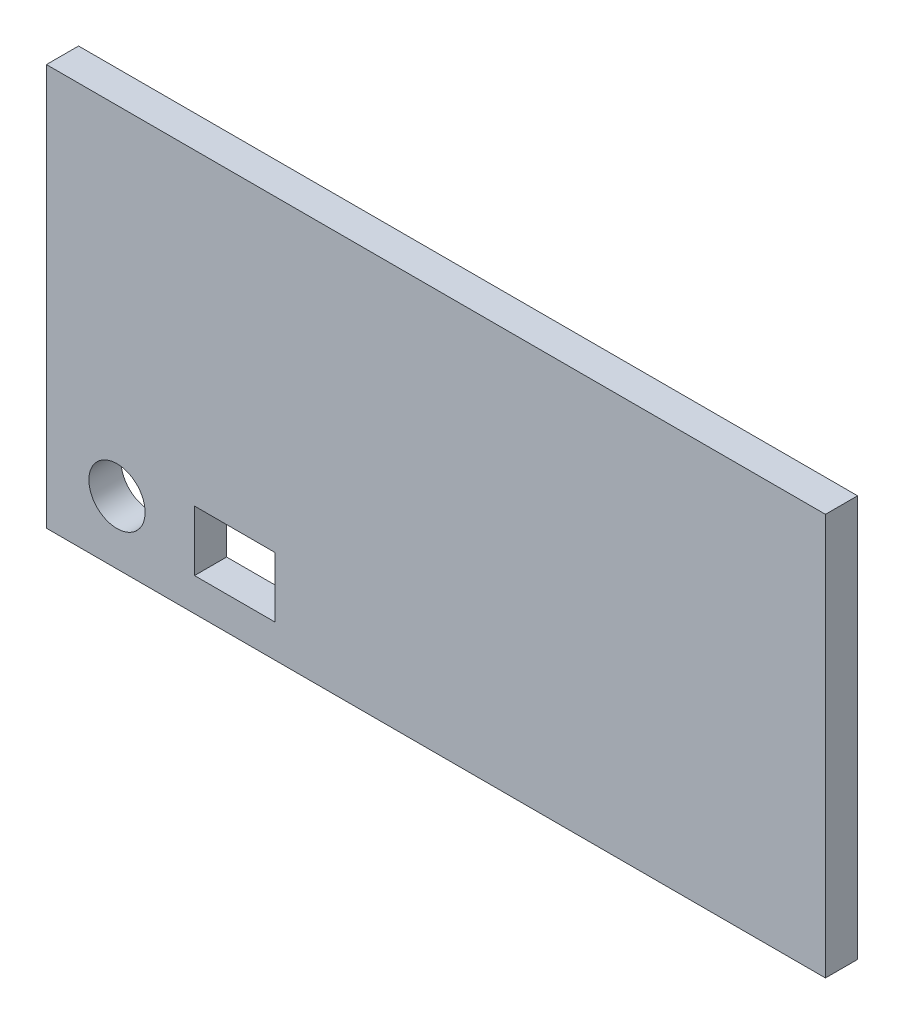
ISO-10303-21;
HEADER;
FILE_DESCRIPTION(('STEP AP214'),'2;1');
FILE_NAME('part.step','',(''),(''),'','','');
FILE_SCHEMA(('AUTOMOTIVE_DESIGN { 1 0 10303 214 1 1 1 1 }'));
ENDSEC;
DATA;
#1=APPLICATION_CONTEXT('core data for automotive mechanical design processes');
#2=APPLICATION_PROTOCOL_DEFINITION('international standard','automotive_design',2000,#1);
#3=PRODUCT_CONTEXT('',#1,'mechanical');
#4=PRODUCT('Part','Part','',(#3));
#5=PRODUCT_RELATED_PRODUCT_CATEGORY('part','',(#4));
#6=PRODUCT_DEFINITION_FORMATION('','',#4);
#7=PRODUCT_DEFINITION_CONTEXT('part definition',#1,'design');
#8=PRODUCT_DEFINITION('design','',#6,#7);
#9=PRODUCT_DEFINITION_SHAPE('','',#8);
#10=(LENGTH_UNIT() NAMED_UNIT(*) SI_UNIT(.MILLI.,.METRE.));
#11=(NAMED_UNIT(*) PLANE_ANGLE_UNIT() SI_UNIT($,.RADIAN.));
#12=(NAMED_UNIT(*) SI_UNIT($,.STERADIAN.) SOLID_ANGLE_UNIT());
#13=UNCERTAINTY_MEASURE_WITH_UNIT(LENGTH_MEASURE(1.E-05),#10,'distance_accuracy_value','');
#14=(GEOMETRIC_REPRESENTATION_CONTEXT(3) GLOBAL_UNCERTAINTY_ASSIGNED_CONTEXT((#13)) GLOBAL_UNIT_ASSIGNED_CONTEXT((#10,
#11,#12)) REPRESENTATION_CONTEXT('',''));
#15=CARTESIAN_POINT('',(0.,0.,0.));
#16=DIRECTION('',(0.,0.,1.));
#17=DIRECTION('',(1.,0.,0.));
#18=AXIS2_PLACEMENT_3D('',#15,#16,#17);
#19=CARTESIAN_POINT('',(0.,0.,8.));
#20=DIRECTION('',(0.,0.,1.));
#21=DIRECTION('',(1.,0.,0.));
#22=AXIS2_PLACEMENT_3D('',#19,#20,#21);
#23=PLANE('',#22);
#24=DIRECTION('',(0.,-1.,0.));
#25=VECTOR('',#24,1.);
#26=CARTESIAN_POINT('',(-104.714285714286,58.75,8.));
#27=LINE('',#26,#25);
#28=CARTESIAN_POINT('',(-104.714285714286,58.75,8.));
#29=VERTEX_POINT('',#28);
#30=CARTESIAN_POINT('',(-104.714285714286,-41.25,8.));
#31=VERTEX_POINT('',#30);
#32=EDGE_CURVE('E142',#29,#31,#27,.T.);
#33=ORIENTED_EDGE('',*,*,#32,.T.);
#34=DIRECTION('',(1.,0.,0.));
#35=VECTOR('',#34,1.);
#36=CARTESIAN_POINT('',(-104.714285714286,-41.25,8.));
#37=LINE('',#36,#35);
#38=CARTESIAN_POINT('',(89.2857142857143,-41.25,8.));
#39=VERTEX_POINT('',#38);
#40=EDGE_CURVE('E145',#31,#39,#37,.T.);
#41=ORIENTED_EDGE('',*,*,#40,.T.);
#42=DIRECTION('',(0.,1.,0.));
#43=VECTOR('',#42,1.);
#44=CARTESIAN_POINT('',(89.2857142857143,58.75,8.));
#45=LINE('',#44,#43);
#46=CARTESIAN_POINT('',(89.2857142857143,58.75,8.));
#47=VERTEX_POINT('',#46);
#48=EDGE_CURVE('E148',#39,#47,#45,.T.);
#49=ORIENTED_EDGE('',*,*,#48,.T.);
#50=DIRECTION('',(-1.,0.,0.));
#51=VECTOR('',#50,1.);
#52=CARTESIAN_POINT('',(-104.714285714286,58.75,8.));
#53=LINE('',#52,#51);
#54=EDGE_CURVE('E150',#47,#29,#53,.T.);
#55=ORIENTED_EDGE('',*,*,#54,.T.);
#56=EDGE_LOOP('',(#33,#41,#49,#55));
#57=FACE_BOUND('',#56,.T.);
#58=CARTESIAN_POINT('',(-87.1428571428571,-25.5357142857143,8.));
#59=DIRECTION('',(0.,0.,1.));
#60=DIRECTION('',(1.,0.,0.));
#61=AXIS2_PLACEMENT_3D('',#58,#59,#60);
#62=CIRCLE('',#61,7.);
#63=CARTESIAN_POINT('',(-80.1428571428571,-25.5357142857143,8.));
#64=VERTEX_POINT('',#63);
#65=EDGE_CURVE('E136',#64,#64,#62,.T.);
#66=ORIENTED_EDGE('',*,*,#65,.F.);
#67=EDGE_LOOP('',(#66));
#68=FACE_BOUND('',#67,.T.);
#69=DIRECTION('',(1.,0.,0.));
#70=VECTOR('',#69,1.);
#71=CARTESIAN_POINT('',(-67.839372956239,-33.0242407706737,8.));
#72=LINE('',#71,#70);
#73=CARTESIAN_POINT('',(-67.839372956239,-33.0242407706737,8.));
#74=VERTEX_POINT('',#73);
#75=CARTESIAN_POINT('',(-47.839372956239,-33.0242407706737,8.));
#76=VERTEX_POINT('',#75);
#77=EDGE_CURVE('E108',#74,#76,#72,.T.);
#78=ORIENTED_EDGE('',*,*,#77,.F.);
#79=DIRECTION('',(0.,-1.,0.));
#80=VECTOR('',#79,1.);
#81=CARTESIAN_POINT('',(-67.839372956239,-18.0242407706737,8.));
#82=LINE('',#81,#80);
#83=CARTESIAN_POINT('',(-67.839372956239,-18.0242407706737,8.));
#84=VERTEX_POINT('',#83);
#85=EDGE_CURVE('E100',#84,#74,#82,.T.);
#86=ORIENTED_EDGE('',*,*,#85,.F.);
#87=DIRECTION('',(-1.,0.,0.));
#88=VECTOR('',#87,1.);
#89=CARTESIAN_POINT('',(-67.839372956239,-18.0242407706737,8.));
#90=LINE('',#89,#88);
#91=CARTESIAN_POINT('',(-47.839372956239,-18.0242407706737,8.));
#92=VERTEX_POINT('',#91);
#93=EDGE_CURVE('E122',#92,#84,#90,.T.);
#94=ORIENTED_EDGE('',*,*,#93,.F.);
#95=DIRECTION('',(0.,1.,0.));
#96=VECTOR('',#95,1.);
#97=CARTESIAN_POINT('',(-47.839372956239,-18.0242407706737,8.));
#98=LINE('',#97,#96);
#99=EDGE_CURVE('E120',#76,#92,#98,.T.);
#100=ORIENTED_EDGE('',*,*,#99,.F.);
#101=EDGE_LOOP('',(#78,#86,#94,#100));
#102=FACE_BOUND('',#101,.T.);
#103=ADVANCED_FACE('F35',(#57,#68,#102),#23,.T.);
#104=CARTESIAN_POINT('',(0.,0.,0.));
#105=DIRECTION('',(0.,0.,1.));
#106=DIRECTION('',(1.,0.,0.));
#107=AXIS2_PLACEMENT_3D('',#104,#105,#106);
#108=PLANE('',#107);
#109=CARTESIAN_POINT('',(-87.1428571428571,-25.5357142857143,0.));
#110=DIRECTION('',(0.,0.,1.));
#111=DIRECTION('',(1.,0.,0.));
#112=AXIS2_PLACEMENT_3D('',#109,#110,#111);
#113=CIRCLE('',#112,7.);
#114=CARTESIAN_POINT('',(-80.1428571428571,-25.5357142857143,0.));
#115=VERTEX_POINT('',#114);
#116=EDGE_CURVE('E116',#115,#115,#113,.T.);
#117=ORIENTED_EDGE('',*,*,#116,.T.);
#118=EDGE_LOOP('',(#117));
#119=FACE_BOUND('',#118,.T.);
#120=DIRECTION('',(0.,-1.,0.));
#121=VECTOR('',#120,1.);
#122=CARTESIAN_POINT('',(-104.714285714286,58.75,0.));
#123=LINE('',#122,#121);
#124=CARTESIAN_POINT('',(-104.714285714286,58.75,0.));
#125=VERTEX_POINT('',#124);
#126=CARTESIAN_POINT('',(-104.714285714286,-41.25,0.));
#127=VERTEX_POINT('',#126);
#128=EDGE_CURVE('E139',#125,#127,#123,.T.);
#129=ORIENTED_EDGE('',*,*,#128,.F.);
#130=DIRECTION('',(-1.,0.,0.));
#131=VECTOR('',#130,1.);
#132=CARTESIAN_POINT('',(-104.714285714286,58.75,0.));
#133=LINE('',#132,#131);
#134=CARTESIAN_POINT('',(89.2857142857143,58.75,0.));
#135=VERTEX_POINT('',#134);
#136=EDGE_CURVE('E146',#135,#125,#133,.T.);
#137=ORIENTED_EDGE('',*,*,#136,.F.);
#138=DIRECTION('',(0.,1.,0.));
#139=VECTOR('',#138,1.);
#140=CARTESIAN_POINT('',(89.2857142857143,58.75,0.));
#141=LINE('',#140,#139);
#142=CARTESIAN_POINT('',(89.2857142857143,-41.25,0.));
#143=VERTEX_POINT('',#142);
#144=EDGE_CURVE('E157',#143,#135,#141,.T.);
#145=ORIENTED_EDGE('',*,*,#144,.F.);
#146=DIRECTION('',(1.,0.,0.));
#147=VECTOR('',#146,1.);
#148=CARTESIAN_POINT('',(-104.714285714286,-41.25,0.));
#149=LINE('',#148,#147);
#150=EDGE_CURVE('E155',#127,#143,#149,.T.);
#151=ORIENTED_EDGE('',*,*,#150,.F.);
#152=EDGE_LOOP('',(#129,#137,#145,#151));
#153=FACE_BOUND('',#152,.T.);
#154=DIRECTION('',(0.,-1.,0.));
#155=VECTOR('',#154,1.);
#156=CARTESIAN_POINT('',(-67.839372956239,-18.0242407706737,0.));
#157=LINE('',#156,#155);
#158=CARTESIAN_POINT('',(-67.839372956239,-18.0242407706737,0.));
#159=VERTEX_POINT('',#158);
#160=CARTESIAN_POINT('',(-67.839372956239,-33.0242407706737,0.));
#161=VERTEX_POINT('',#160);
#162=EDGE_CURVE('E58',#159,#161,#157,.T.);
#163=ORIENTED_EDGE('',*,*,#162,.T.);
#164=DIRECTION('',(1.,0.,0.));
#165=VECTOR('',#164,1.);
#166=CARTESIAN_POINT('',(-67.839372956239,-33.0242407706737,0.));
#167=LINE('',#166,#165);
#168=CARTESIAN_POINT('',(-47.839372956239,-33.0242407706737,0.));
#169=VERTEX_POINT('',#168);
#170=EDGE_CURVE('E115',#161,#169,#167,.T.);
#171=ORIENTED_EDGE('',*,*,#170,.T.);
#172=DIRECTION('',(0.,1.,0.));
#173=VECTOR('',#172,1.);
#174=CARTESIAN_POINT('',(-47.839372956239,-18.0242407706737,0.));
#175=LINE('',#174,#173);
#176=CARTESIAN_POINT('',(-47.839372956239,-18.0242407706737,0.));
#177=VERTEX_POINT('',#176);
#178=EDGE_CURVE('E128',#169,#177,#175,.T.);
#179=ORIENTED_EDGE('',*,*,#178,.T.);
#180=DIRECTION('',(-1.,0.,0.));
#181=VECTOR('',#180,1.);
#182=CARTESIAN_POINT('',(-67.839372956239,-18.0242407706737,0.));
#183=LINE('',#182,#181);
#184=EDGE_CURVE('E109',#177,#159,#183,.T.);
#185=ORIENTED_EDGE('',*,*,#184,.T.);
#186=EDGE_LOOP('',(#163,#171,#179,#185));
#187=FACE_BOUND('',#186,.T.);
#188=ADVANCED_FACE('F175',(#119,#153,#187),#108,.F.);
#189=CARTESIAN_POINT('',(-104.714285714286,58.75,8.));
#190=DIRECTION('',(1.,0.,0.));
#191=DIRECTION('',(0.,1.,0.));
#192=AXIS2_PLACEMENT_3D('',#189,#190,#191);
#193=PLANE('',#192);
#194=ORIENTED_EDGE('',*,*,#128,.T.);
#195=DIRECTION('',(0.,0.,-1.));
#196=VECTOR('',#195,1.);
#197=CARTESIAN_POINT('',(-104.714285714286,-41.25,8.));
#198=LINE('',#197,#196);
#199=EDGE_CURVE('E11',#31,#127,#198,.T.);
#200=ORIENTED_EDGE('',*,*,#199,.F.);
#201=ORIENTED_EDGE('',*,*,#32,.F.);
#202=DIRECTION('',(0.,0.,-1.));
#203=VECTOR('',#202,1.);
#204=CARTESIAN_POINT('',(-104.714285714286,58.75,8.));
#205=LINE('',#204,#203);
#206=EDGE_CURVE('E152',#29,#125,#205,.T.);
#207=ORIENTED_EDGE('',*,*,#206,.T.);
#208=EDGE_LOOP('',(#194,#200,#201,#207));
#209=FACE_BOUND('',#208,.T.);
#210=ADVANCED_FACE('F37',(#209),#193,.F.);
#211=CARTESIAN_POINT('',(-104.714285714286,-41.25,8.));
#212=DIRECTION('',(0.,1.,0.));
#213=DIRECTION('',(0.,0.,1.));
#214=AXIS2_PLACEMENT_3D('',#211,#212,#213);
#215=PLANE('',#214);
#216=ORIENTED_EDGE('',*,*,#150,.T.);
#217=DIRECTION('',(0.,0.,-1.));
#218=VECTOR('',#217,1.);
#219=CARTESIAN_POINT('',(89.2857142857143,-41.25,8.));
#220=LINE('',#219,#218);
#221=EDGE_CURVE('E43',#39,#143,#220,.T.);
#222=ORIENTED_EDGE('',*,*,#221,.F.);
#223=ORIENTED_EDGE('',*,*,#40,.F.);
#224=ORIENTED_EDGE('',*,*,#199,.T.);
#225=EDGE_LOOP('',(#216,#222,#223,#224));
#226=FACE_BOUND('',#225,.T.);
#227=ADVANCED_FACE('F186',(#226),#215,.F.);
#228=CARTESIAN_POINT('',(89.2857142857143,58.75,8.));
#229=DIRECTION('',(-1.,0.,0.));
#230=DIRECTION('',(0.,0.,1.));
#231=AXIS2_PLACEMENT_3D('',#228,#229,#230);
#232=PLANE('',#231);
#233=ORIENTED_EDGE('',*,*,#144,.T.);
#234=DIRECTION('',(0.,0.,-1.));
#235=VECTOR('',#234,1.);
#236=CARTESIAN_POINT('',(89.2857142857143,58.75,8.));
#237=LINE('',#236,#235);
#238=EDGE_CURVE('E162',#47,#135,#237,.T.);
#239=ORIENTED_EDGE('',*,*,#238,.F.);
#240=ORIENTED_EDGE('',*,*,#48,.F.);
#241=ORIENTED_EDGE('',*,*,#221,.T.);
#242=EDGE_LOOP('',(#233,#239,#240,#241));
#243=FACE_BOUND('',#242,.T.);
#244=ADVANCED_FACE('F169',(#243),#232,.F.);
#245=CARTESIAN_POINT('',(-104.714285714286,58.75,8.));
#246=DIRECTION('',(0.,-1.,0.));
#247=DIRECTION('',(0.,0.,-1.));
#248=AXIS2_PLACEMENT_3D('',#245,#246,#247);
#249=PLANE('',#248);
#250=ORIENTED_EDGE('',*,*,#136,.T.);
#251=ORIENTED_EDGE('',*,*,#206,.F.);
#252=ORIENTED_EDGE('',*,*,#54,.F.);
#253=ORIENTED_EDGE('',*,*,#238,.T.);
#254=EDGE_LOOP('',(#250,#251,#252,#253));
#255=FACE_BOUND('',#254,.T.);
#256=ADVANCED_FACE('F179',(#255),#249,.F.);
#257=CARTESIAN_POINT('',(-87.1428571428571,-25.5357142857143,8.));
#258=DIRECTION('',(0.,0.,-1.));
#259=DIRECTION('',(-1.,0.,0.));
#260=AXIS2_PLACEMENT_3D('',#257,#258,#259);
#261=CYLINDRICAL_SURFACE('',#260,7.);
#262=ORIENTED_EDGE('',*,*,#65,.T.);
#263=EDGE_LOOP('',(#262));
#264=FACE_BOUND('',#263,.T.);
#265=ORIENTED_EDGE('',*,*,#116,.F.);
#266=EDGE_LOOP('',(#265));
#267=FACE_BOUND('',#266,.T.);
#268=ADVANCED_FACE('F201',(#264,#267),#261,.F.);
#269=CARTESIAN_POINT('',(-67.839372956239,-18.0242407706737,8.));
#270=DIRECTION('',(1.,0.,0.));
#271=DIRECTION('',(0.,0.,-1.));
#272=AXIS2_PLACEMENT_3D('',#269,#270,#271);
#273=PLANE('',#272);
#274=ORIENTED_EDGE('',*,*,#162,.F.);
#275=DIRECTION('',(0.,0.,-1.));
#276=VECTOR('',#275,1.);
#277=CARTESIAN_POINT('',(-67.839372956239,-18.0242407706737,8.));
#278=LINE('',#277,#276);
#279=EDGE_CURVE('E104',#84,#159,#278,.T.);
#280=ORIENTED_EDGE('',*,*,#279,.F.);
#281=ORIENTED_EDGE('',*,*,#85,.T.);
#282=DIRECTION('',(0.,0.,-1.));
#283=VECTOR('',#282,1.);
#284=CARTESIAN_POINT('',(-67.839372956239,-33.0242407706737,8.));
#285=LINE('',#284,#283);
#286=EDGE_CURVE('E103',#74,#161,#285,.T.);
#287=ORIENTED_EDGE('',*,*,#286,.T.);
#288=EDGE_LOOP('',(#274,#280,#281,#287));
#289=FACE_BOUND('',#288,.T.);
#290=ADVANCED_FACE('F102',(#289),#273,.T.);
#291=CARTESIAN_POINT('',(-67.839372956239,-33.0242407706737,8.));
#292=DIRECTION('',(0.,1.,0.));
#293=DIRECTION('',(-1.,0.,0.));
#294=AXIS2_PLACEMENT_3D('',#291,#292,#293);
#295=PLANE('',#294);
#296=ORIENTED_EDGE('',*,*,#170,.F.);
#297=ORIENTED_EDGE('',*,*,#286,.F.);
#298=ORIENTED_EDGE('',*,*,#77,.T.);
#299=DIRECTION('',(0.,0.,-1.));
#300=VECTOR('',#299,1.);
#301=CARTESIAN_POINT('',(-47.839372956239,-33.0242407706737,8.));
#302=LINE('',#301,#300);
#303=EDGE_CURVE('E117',#76,#169,#302,.T.);
#304=ORIENTED_EDGE('',*,*,#303,.T.);
#305=EDGE_LOOP('',(#296,#297,#298,#304));
#306=FACE_BOUND('',#305,.T.);
#307=ADVANCED_FACE('F112',(#306),#295,.T.);
#308=CARTESIAN_POINT('',(-47.839372956239,-18.0242407706737,8.));
#309=DIRECTION('',(-1.,0.,0.));
#310=DIRECTION('',(0.,0.,1.));
#311=AXIS2_PLACEMENT_3D('',#308,#309,#310);
#312=PLANE('',#311);
#313=ORIENTED_EDGE('',*,*,#178,.F.);
#314=ORIENTED_EDGE('',*,*,#303,.F.);
#315=ORIENTED_EDGE('',*,*,#99,.T.);
#316=DIRECTION('',(0.,0.,-1.));
#317=VECTOR('',#316,1.);
#318=CARTESIAN_POINT('',(-47.839372956239,-18.0242407706737,8.));
#319=LINE('',#318,#317);
#320=EDGE_CURVE('E50',#92,#177,#319,.T.);
#321=ORIENTED_EDGE('',*,*,#320,.T.);
#322=EDGE_LOOP('',(#313,#314,#315,#321));
#323=FACE_BOUND('',#322,.T.);
#324=ADVANCED_FACE('F218',(#323),#312,.T.);
#325=CARTESIAN_POINT('',(-67.839372956239,-18.0242407706737,8.));
#326=DIRECTION('',(0.,-1.,0.));
#327=DIRECTION('',(0.,0.,-1.));
#328=AXIS2_PLACEMENT_3D('',#325,#326,#327);
#329=PLANE('',#328);
#330=ORIENTED_EDGE('',*,*,#184,.F.);
#331=ORIENTED_EDGE('',*,*,#320,.F.);
#332=ORIENTED_EDGE('',*,*,#93,.T.);
#333=ORIENTED_EDGE('',*,*,#279,.T.);
#334=EDGE_LOOP('',(#330,#331,#332,#333));
#335=FACE_BOUND('',#334,.T.);
#336=ADVANCED_FACE('F223',(#335),#329,.T.);
#337=CLOSED_SHELL('',(#103,#188,#210,#227,#244,#256,#268,#290,#307,#324,#336));
#338=MANIFOLD_SOLID_BREP('B2',#337);
#339=ADVANCED_BREP_SHAPE_REPRESENTATION('',(#18,#338),#14);
#340=SHAPE_DEFINITION_REPRESENTATION(#9,#339);
ENDSEC;
END-ISO-10303-21;
